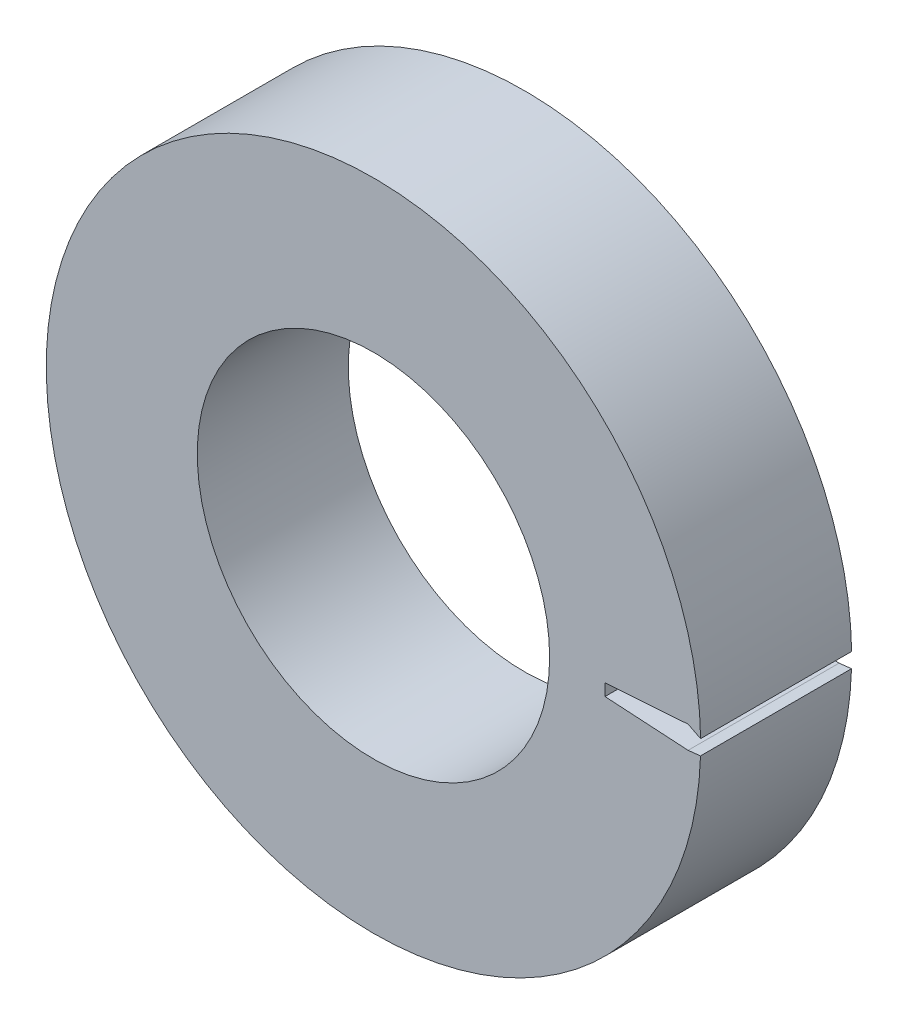
ISO-10303-21;
HEADER;
FILE_DESCRIPTION(('STEP AP214'),'2;1');
FILE_NAME('part.step','',(''),(''),'','','');
FILE_SCHEMA(('AUTOMOTIVE_DESIGN { 1 0 10303 214 1 1 1 1 }'));
ENDSEC;
DATA;
#1=APPLICATION_CONTEXT('core data for automotive mechanical design processes');
#2=APPLICATION_PROTOCOL_DEFINITION('international standard','automotive_design',2000,#1);
#3=PRODUCT_CONTEXT('',#1,'mechanical');
#4=PRODUCT('Part','Part','',(#3));
#5=PRODUCT_RELATED_PRODUCT_CATEGORY('part','',(#4));
#6=PRODUCT_DEFINITION_FORMATION('','',#4);
#7=PRODUCT_DEFINITION_CONTEXT('part definition',#1,'design');
#8=PRODUCT_DEFINITION('design','',#6,#7);
#9=PRODUCT_DEFINITION_SHAPE('','',#8);
#10=(LENGTH_UNIT() NAMED_UNIT(*) SI_UNIT(.MILLI.,.METRE.));
#11=(NAMED_UNIT(*) PLANE_ANGLE_UNIT() SI_UNIT($,.RADIAN.));
#12=(NAMED_UNIT(*) SI_UNIT($,.STERADIAN.) SOLID_ANGLE_UNIT());
#13=UNCERTAINTY_MEASURE_WITH_UNIT(LENGTH_MEASURE(1.E-05),#10,'distance_accuracy_value','');
#14=(GEOMETRIC_REPRESENTATION_CONTEXT(3) GLOBAL_UNCERTAINTY_ASSIGNED_CONTEXT((#13)) GLOBAL_UNIT_ASSIGNED_CONTEXT((#10,
#11,#12)) REPRESENTATION_CONTEXT('',''));
#15=CARTESIAN_POINT('',(0.,0.,0.));
#16=DIRECTION('',(0.,0.,1.));
#17=DIRECTION('',(1.,0.,0.));
#18=AXIS2_PLACEMENT_3D('',#15,#16,#17);
#19=CARTESIAN_POINT('',(0.,0.,15.));
#20=DIRECTION('',(0.,0.,1.));
#21=DIRECTION('',(1.,0.,0.));
#22=AXIS2_PLACEMENT_3D('',#19,#20,#21);
#23=PLANE('',#22);
#24=DIRECTION('',(-0.894427190999916,0.447213595499958,0.));
#25=VECTOR('',#24,1.);
#26=CARTESIAN_POINT('',(13.4,26.8,15.));
#27=LINE('',#26,#25);
#28=CARTESIAN_POINT('',(64.9922474796359,1.00387626018204,15.));
#29=VERTEX_POINT('',#28);
#30=CARTESIAN_POINT('',(62.5,2.25,15.));
#31=VERTEX_POINT('',#30);
#32=EDGE_CURVE('E134',#29,#31,#27,.T.);
#33=ORIENTED_EDGE('',*,*,#32,.F.);
#34=CARTESIAN_POINT('',(0.,0.,15.));
#35=DIRECTION('',(0.,0.,1.));
#36=DIRECTION('',(1.,0.,0.));
#37=AXIS2_PLACEMENT_3D('',#34,#35,#36);
#38=CIRCLE('',#37,65.);
#39=CARTESIAN_POINT('',(64.9699712762505,-1.97555874708327,15.));
#40=VERTEX_POINT('',#39);
#41=EDGE_CURVE('E119',#29,#40,#38,.T.);
#42=ORIENTED_EDGE('',*,*,#41,.T.);
#43=DIRECTION('',(0.993883734673619,0.110431526074846,0.));
#44=VECTOR('',#43,1.);
#45=CARTESIAN_POINT('',(1.00914634146341,-9.08231707317073,15.));
#46=LINE('',#45,#44);
#47=CARTESIAN_POINT('',(62.5,-2.25,15.));
#48=VERTEX_POINT('',#47);
#49=EDGE_CURVE('E50',#48,#40,#46,.T.);
#50=ORIENTED_EDGE('',*,*,#49,.F.);
#51=DIRECTION('',(0.998168496631191,-0.0604950604018904,0.));
#52=VECTOR('',#51,1.);
#53=CARTESIAN_POINT('',(0.0928636779505946,1.53225068618481,15.));
#54=LINE('',#53,#52);
#55=CARTESIAN_POINT('',(46.,-1.25,15.));
#56=VERTEX_POINT('',#55);
#57=EDGE_CURVE('E106',#56,#48,#54,.T.);
#58=ORIENTED_EDGE('',*,*,#57,.F.);
#59=DIRECTION('',(0.,-1.,0.));
#60=VECTOR('',#59,1.);
#61=CARTESIAN_POINT('',(46.,0.,15.));
#62=LINE('',#61,#60);
#63=CARTESIAN_POINT('',(46.,1.125,15.));
#64=VERTEX_POINT('',#63);
#65=EDGE_CURVE('E128',#64,#56,#62,.T.);
#66=ORIENTED_EDGE('',*,*,#65,.F.);
#67=DIRECTION('',(-0.99768369268154,-0.0680238881373777,0.));
#68=VECTOR('',#67,1.);
#69=CARTESIAN_POINT('',(0.136503856041131,-2.00205655526992,15.));
#70=LINE('',#69,#68);
#71=EDGE_CURVE('E58',#31,#64,#70,.T.);
#72=ORIENTED_EDGE('',*,*,#71,.F.);
#73=EDGE_LOOP('',(#33,#42,#50,#58,#66,#72));
#74=FACE_BOUND('',#73,.T.);
#75=CARTESIAN_POINT('',(0.,0.,15.));
#76=DIRECTION('',(0.,0.,1.));
#77=DIRECTION('',(1.,0.,0.));
#78=AXIS2_PLACEMENT_3D('',#75,#76,#77);
#79=CIRCLE('',#78,35.);
#80=CARTESIAN_POINT('',(35.,0.,15.));
#81=VERTEX_POINT('',#80);
#82=EDGE_CURVE('E122',#81,#81,#79,.T.);
#83=ORIENTED_EDGE('',*,*,#82,.F.);
#84=EDGE_LOOP('',(#83));
#85=FACE_BOUND('',#84,.T.);
#86=ADVANCED_FACE('F35',(#74,#85),#23,.T.);
#87=CARTESIAN_POINT('',(0.,0.,-15.));
#88=DIRECTION('',(0.,0.,1.));
#89=DIRECTION('',(1.,0.,0.));
#90=AXIS2_PLACEMENT_3D('',#87,#88,#89);
#91=PLANE('',#90);
#92=CARTESIAN_POINT('',(0.,0.,-15.));
#93=DIRECTION('',(0.,0.,1.));
#94=DIRECTION('',(1.,0.,0.));
#95=AXIS2_PLACEMENT_3D('',#92,#93,#94);
#96=CIRCLE('',#95,65.);
#97=CARTESIAN_POINT('',(64.9922474796359,1.00387626018204,-15.));
#98=VERTEX_POINT('',#97);
#99=CARTESIAN_POINT('',(64.9699712762506,-1.97555874708327,-15.));
#100=VERTEX_POINT('',#99);
#101=EDGE_CURVE('E120',#98,#100,#96,.T.);
#102=ORIENTED_EDGE('',*,*,#101,.F.);
#103=DIRECTION('',(-0.894427190999916,0.447213595499958,0.));
#104=VECTOR('',#103,1.);
#105=CARTESIAN_POINT('',(13.4,26.8,-15.));
#106=LINE('',#105,#104);
#107=CARTESIAN_POINT('',(62.5,2.25,-15.));
#108=VERTEX_POINT('',#107);
#109=EDGE_CURVE('E136',#98,#108,#106,.T.);
#110=ORIENTED_EDGE('',*,*,#109,.T.);
#111=DIRECTION('',(-0.99768369268154,-0.0680238881373777,0.));
#112=VECTOR('',#111,1.);
#113=CARTESIAN_POINT('',(0.136503856041131,-2.00205655526992,-15.));
#114=LINE('',#113,#112);
#115=CARTESIAN_POINT('',(46.,1.125,-15.));
#116=VERTEX_POINT('',#115);
#117=EDGE_CURVE('E11',#108,#116,#114,.T.);
#118=ORIENTED_EDGE('',*,*,#117,.T.);
#119=DIRECTION('',(0.,-1.,0.));
#120=VECTOR('',#119,1.);
#121=CARTESIAN_POINT('',(46.,0.,-15.));
#122=LINE('',#121,#120);
#123=CARTESIAN_POINT('',(46.,-1.25,-15.));
#124=VERTEX_POINT('',#123);
#125=EDGE_CURVE('E43',#116,#124,#122,.T.);
#126=ORIENTED_EDGE('',*,*,#125,.T.);
#127=DIRECTION('',(0.998168496631191,-0.0604950604018904,0.));
#128=VECTOR('',#127,1.);
#129=CARTESIAN_POINT('',(0.0928636779505946,1.53225068618481,-15.));
#130=LINE('',#129,#128);
#131=CARTESIAN_POINT('',(62.5,-2.25,-15.));
#132=VERTEX_POINT('',#131);
#133=EDGE_CURVE('E103',#124,#132,#130,.T.);
#134=ORIENTED_EDGE('',*,*,#133,.T.);
#135=DIRECTION('',(0.993883734673619,0.110431526074846,0.));
#136=VECTOR('',#135,1.);
#137=CARTESIAN_POINT('',(1.00914634146341,-9.08231707317073,-15.));
#138=LINE('',#137,#136);
#139=EDGE_CURVE('E89',#132,#100,#138,.T.);
#140=ORIENTED_EDGE('',*,*,#139,.T.);
#141=EDGE_LOOP('',(#102,#110,#118,#126,#134,#140));
#142=FACE_BOUND('',#141,.T.);
#143=CARTESIAN_POINT('',(0.,0.,-15.));
#144=DIRECTION('',(0.,0.,1.));
#145=DIRECTION('',(1.,0.,0.));
#146=AXIS2_PLACEMENT_3D('',#143,#144,#145);
#147=CIRCLE('',#146,35.);
#148=CARTESIAN_POINT('',(35.,0.,-15.));
#149=VERTEX_POINT('',#148);
#150=EDGE_CURVE('E125',#149,#149,#147,.T.);
#151=ORIENTED_EDGE('',*,*,#150,.T.);
#152=EDGE_LOOP('',(#151));
#153=FACE_BOUND('',#152,.T.);
#154=ADVANCED_FACE('F111',(#142,#153),#91,.F.);
#155=CARTESIAN_POINT('',(0.,0.,15.));
#156=DIRECTION('',(0.,0.,-1.));
#157=DIRECTION('',(-1.,0.,0.));
#158=AXIS2_PLACEMENT_3D('',#155,#156,#157);
#159=CYLINDRICAL_SURFACE('',#158,65.);
#160=ORIENTED_EDGE('',*,*,#41,.F.);
#161=DIRECTION('',(0.,0.,-1.));
#162=VECTOR('',#161,1.);
#163=CARTESIAN_POINT('',(64.9922474796359,1.00387626018204,15.));
#164=LINE('',#163,#162);
#165=EDGE_CURVE('E113',#29,#98,#164,.T.);
#166=ORIENTED_EDGE('',*,*,#165,.T.);
#167=ORIENTED_EDGE('',*,*,#101,.T.);
#168=DIRECTION('',(0.,0.,-1.));
#169=VECTOR('',#168,1.);
#170=CARTESIAN_POINT('',(64.9699712762506,-1.97555874708327,15.));
#171=LINE('',#170,#169);
#172=EDGE_CURVE('E93',#100,#40,#171,.F.);
#173=ORIENTED_EDGE('',*,*,#172,.T.);
#174=EDGE_LOOP('',(#160,#166,#167,#173));
#175=FACE_BOUND('',#174,.T.);
#176=ADVANCED_FACE('F37',(#175),#159,.T.);
#177=CARTESIAN_POINT('',(0.,0.,15.));
#178=DIRECTION('',(0.,0.,-1.));
#179=DIRECTION('',(-1.,0.,0.));
#180=AXIS2_PLACEMENT_3D('',#177,#178,#179);
#181=CYLINDRICAL_SURFACE('',#180,35.);
#182=ORIENTED_EDGE('',*,*,#82,.T.);
#183=EDGE_LOOP('',(#182));
#184=FACE_BOUND('',#183,.T.);
#185=ORIENTED_EDGE('',*,*,#150,.F.);
#186=EDGE_LOOP('',(#185));
#187=FACE_BOUND('',#186,.T.);
#188=ADVANCED_FACE('F161',(#184,#187),#181,.F.);
#189=CARTESIAN_POINT('',(46.,1.125,-20.));
#190=DIRECTION('',(-1.,0.,0.));
#191=DIRECTION('',(0.,0.,1.));
#192=AXIS2_PLACEMENT_3D('',#189,#190,#191);
#193=PLANE('',#192);
#194=ORIENTED_EDGE('',*,*,#65,.T.);
#195=DIRECTION('',(0.,0.,1.));
#196=VECTOR('',#195,1.);
#197=CARTESIAN_POINT('',(46.,-1.25,-20.));
#198=LINE('',#197,#196);
#199=EDGE_CURVE('E108',#124,#56,#198,.T.);
#200=ORIENTED_EDGE('',*,*,#199,.F.);
#201=ORIENTED_EDGE('',*,*,#125,.F.);
#202=DIRECTION('',(0.,0.,1.));
#203=VECTOR('',#202,1.);
#204=CARTESIAN_POINT('',(46.,1.125,-20.));
#205=LINE('',#204,#203);
#206=EDGE_CURVE('E98',#116,#64,#205,.T.);
#207=ORIENTED_EDGE('',*,*,#206,.T.);
#208=EDGE_LOOP('',(#194,#200,#201,#207));
#209=FACE_BOUND('',#208,.T.);
#210=ADVANCED_FACE('F144',(#209),#193,.F.);
#211=CARTESIAN_POINT('',(62.5,2.25,-20.));
#212=DIRECTION('',(-0.0680238881373777,0.99768369268154,0.));
#213=DIRECTION('',(-0.99768369268154,-0.0680238881373777,0.));
#214=AXIS2_PLACEMENT_3D('',#211,#212,#213);
#215=PLANE('',#214);
#216=ORIENTED_EDGE('',*,*,#71,.T.);
#217=ORIENTED_EDGE('',*,*,#206,.F.);
#218=ORIENTED_EDGE('',*,*,#117,.F.);
#219=DIRECTION('',(0.,0.,1.));
#220=VECTOR('',#219,1.);
#221=CARTESIAN_POINT('',(62.5,2.25,-20.));
#222=LINE('',#221,#220);
#223=EDGE_CURVE('E107',#108,#31,#222,.T.);
#224=ORIENTED_EDGE('',*,*,#223,.T.);
#225=EDGE_LOOP('',(#216,#217,#218,#224));
#226=FACE_BOUND('',#225,.T.);
#227=ADVANCED_FACE('F153',(#226),#215,.F.);
#228=CARTESIAN_POINT('',(46.,-1.25,-20.));
#229=DIRECTION('',(-0.0604950604018903,-0.998168496631191,0.));
#230=DIRECTION('',(0.998168496631191,-0.0604950604018904,0.));
#231=AXIS2_PLACEMENT_3D('',#228,#229,#230);
#232=PLANE('',#231);
#233=ORIENTED_EDGE('',*,*,#57,.T.);
#234=DIRECTION('',(0.,0.,1.));
#235=VECTOR('',#234,1.);
#236=CARTESIAN_POINT('',(62.5,-2.25,-20.));
#237=LINE('',#236,#235);
#238=EDGE_CURVE('E92',#132,#48,#237,.T.);
#239=ORIENTED_EDGE('',*,*,#238,.F.);
#240=ORIENTED_EDGE('',*,*,#133,.F.);
#241=ORIENTED_EDGE('',*,*,#199,.T.);
#242=EDGE_LOOP('',(#233,#239,#240,#241));
#243=FACE_BOUND('',#242,.T.);
#244=ADVANCED_FACE('F101',(#243),#232,.F.);
#245=CARTESIAN_POINT('',(67.,0.,-20.));
#246=DIRECTION('',(0.447213595499958,0.894427190999916,0.));
#247=DIRECTION('',(-0.894427190999916,0.447213595499958,0.));
#248=AXIS2_PLACEMENT_3D('',#245,#246,#247);
#249=PLANE('',#248);
#250=ORIENTED_EDGE('',*,*,#32,.T.);
#251=ORIENTED_EDGE('',*,*,#223,.F.);
#252=ORIENTED_EDGE('',*,*,#109,.F.);
#253=ORIENTED_EDGE('',*,*,#165,.F.);
#254=EDGE_LOOP('',(#250,#251,#252,#253));
#255=FACE_BOUND('',#254,.T.);
#256=ADVANCED_FACE('F152',(#255),#249,.F.);
#257=CARTESIAN_POINT('',(62.5,-2.25,-20.));
#258=DIRECTION('',(0.110431526074846,-0.993883734673619,0.));
#259=DIRECTION('',(0.993883734673619,0.110431526074846,0.));
#260=AXIS2_PLACEMENT_3D('',#257,#258,#259);
#261=PLANE('',#260);
#262=ORIENTED_EDGE('',*,*,#49,.T.);
#263=ORIENTED_EDGE('',*,*,#172,.F.);
#264=ORIENTED_EDGE('',*,*,#139,.F.);
#265=ORIENTED_EDGE('',*,*,#238,.T.);
#266=EDGE_LOOP('',(#262,#263,#264,#265));
#267=FACE_BOUND('',#266,.T.);
#268=ADVANCED_FACE('F91',(#267),#261,.F.);
#269=CLOSED_SHELL('',(#86,#154,#176,#188,#210,#227,#244,#256,#268));
#270=MANIFOLD_SOLID_BREP('B2',#269);
#271=ADVANCED_BREP_SHAPE_REPRESENTATION('',(#18,#270),#14);
#272=SHAPE_DEFINITION_REPRESENTATION(#9,#271);
ENDSEC;
END-ISO-10303-21;
